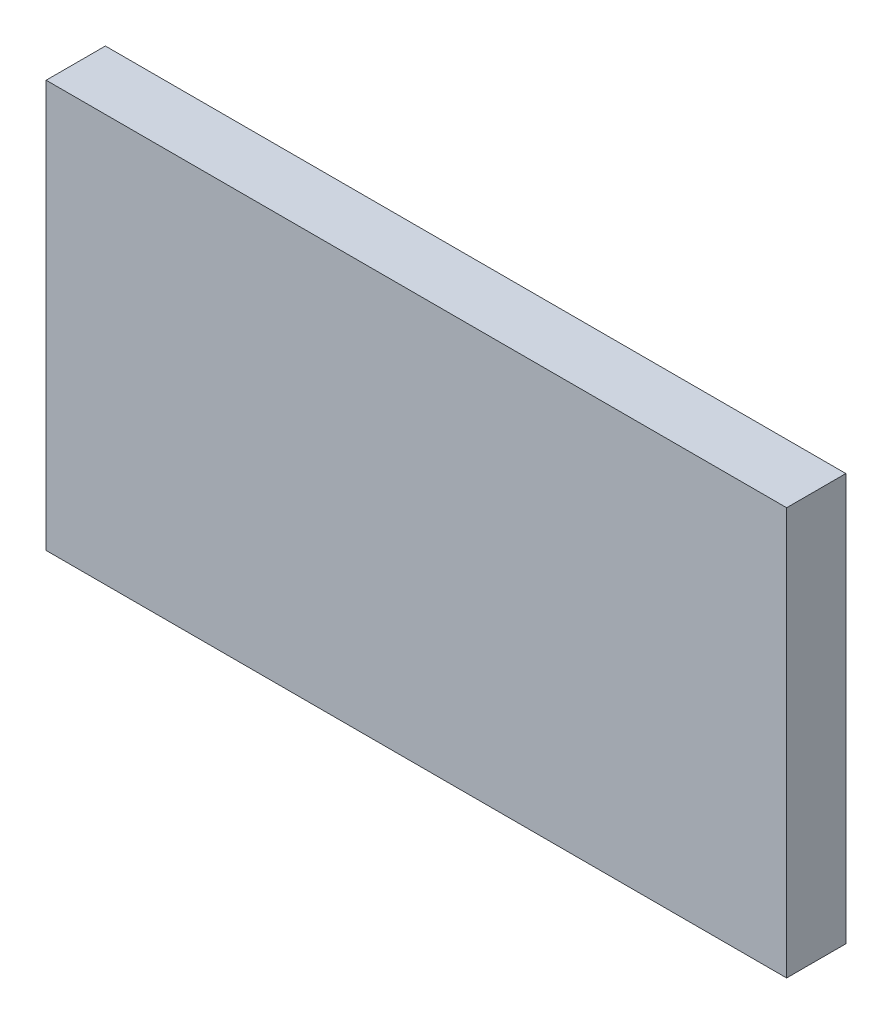
ISO-10303-21;
HEADER;
FILE_DESCRIPTION(('STEP AP214'),'2;1');
FILE_NAME('part.step','',(''),(''),'','','');
FILE_SCHEMA(('AUTOMOTIVE_DESIGN { 1 0 10303 214 1 1 1 1 }'));
ENDSEC;
DATA;
#1=APPLICATION_CONTEXT('core data for automotive mechanical design processes');
#2=APPLICATION_PROTOCOL_DEFINITION('international standard','automotive_design',2000,#1);
#3=PRODUCT_CONTEXT('',#1,'mechanical');
#4=PRODUCT('Part','Part','',(#3));
#5=PRODUCT_RELATED_PRODUCT_CATEGORY('part','',(#4));
#6=PRODUCT_DEFINITION_FORMATION('','',#4);
#7=PRODUCT_DEFINITION_CONTEXT('part definition',#1,'design');
#8=PRODUCT_DEFINITION('design','',#6,#7);
#9=PRODUCT_DEFINITION_SHAPE('','',#8);
#10=(LENGTH_UNIT() NAMED_UNIT(*) SI_UNIT(.MILLI.,.METRE.));
#11=(NAMED_UNIT(*) PLANE_ANGLE_UNIT() SI_UNIT($,.RADIAN.));
#12=(NAMED_UNIT(*) SI_UNIT($,.STERADIAN.) SOLID_ANGLE_UNIT());
#13=UNCERTAINTY_MEASURE_WITH_UNIT(LENGTH_MEASURE(1.E-05),#10,'distance_accuracy_value','');
#14=(GEOMETRIC_REPRESENTATION_CONTEXT(3) GLOBAL_UNCERTAINTY_ASSIGNED_CONTEXT((#13)) GLOBAL_UNIT_ASSIGNED_CONTEXT((#10,
#11,#12)) REPRESENTATION_CONTEXT('',''));
#15=CARTESIAN_POINT('',(0.,0.,0.));
#16=DIRECTION('',(0.,0.,1.));
#17=DIRECTION('',(1.,0.,0.));
#18=AXIS2_PLACEMENT_3D('',#15,#16,#17);
#19=CARTESIAN_POINT('',(50.,27.5,8.));
#20=DIRECTION('',(-1.,0.,0.));
#21=DIRECTION('',(0.,0.,1.));
#22=AXIS2_PLACEMENT_3D('',#19,#20,#21);
#23=PLANE('',#22);
#24=DIRECTION('',(0.,1.,0.));
#25=VECTOR('',#24,1.);
#26=CARTESIAN_POINT('',(50.,27.5,0.));
#27=LINE('',#26,#25);
#28=CARTESIAN_POINT('',(50.,-27.5,0.));
#29=VERTEX_POINT('',#28);
#30=CARTESIAN_POINT('',(50.,27.5,0.));
#31=VERTEX_POINT('',#30);
#32=EDGE_CURVE('E95',#29,#31,#27,.T.);
#33=ORIENTED_EDGE('',*,*,#32,.T.);
#34=DIRECTION('',(0.,0.,-1.));
#35=VECTOR('',#34,1.);
#36=CARTESIAN_POINT('',(50.,27.5,8.));
#37=LINE('',#36,#35);
#38=CARTESIAN_POINT('',(50.,27.5,8.));
#39=VERTEX_POINT('',#38);
#40=EDGE_CURVE('E11',#39,#31,#37,.T.);
#41=ORIENTED_EDGE('',*,*,#40,.F.);
#42=DIRECTION('',(0.,1.,0.));
#43=VECTOR('',#42,1.);
#44=CARTESIAN_POINT('',(50.,27.5,8.));
#45=LINE('',#44,#43);
#46=CARTESIAN_POINT('',(50.,-27.5,8.));
#47=VERTEX_POINT('',#46);
#48=EDGE_CURVE('E83',#47,#39,#45,.T.);
#49=ORIENTED_EDGE('',*,*,#48,.F.);
#50=DIRECTION('',(0.,0.,-1.));
#51=VECTOR('',#50,1.);
#52=CARTESIAN_POINT('',(50.,-27.5,8.));
#53=LINE('',#52,#51);
#54=EDGE_CURVE('E91',#47,#29,#53,.T.);
#55=ORIENTED_EDGE('',*,*,#54,.T.);
#56=EDGE_LOOP('',(#33,#41,#49,#55));
#57=FACE_BOUND('',#56,.T.);
#58=ADVANCED_FACE('F32',(#57),#23,.F.);
#59=CARTESIAN_POINT('',(-50.,27.5,8.));
#60=DIRECTION('',(0.,-1.,0.));
#61=DIRECTION('',(0.,0.,-1.));
#62=AXIS2_PLACEMENT_3D('',#59,#60,#61);
#63=PLANE('',#62);
#64=DIRECTION('',(-1.,0.,0.));
#65=VECTOR('',#64,1.);
#66=CARTESIAN_POINT('',(-50.,27.5,0.));
#67=LINE('',#66,#65);
#68=CARTESIAN_POINT('',(-50.,27.5,0.));
#69=VERTEX_POINT('',#68);
#70=EDGE_CURVE('E87',#31,#69,#67,.T.);
#71=ORIENTED_EDGE('',*,*,#70,.T.);
#72=DIRECTION('',(0.,0.,-1.));
#73=VECTOR('',#72,1.);
#74=CARTESIAN_POINT('',(-50.,27.5,8.));
#75=LINE('',#74,#73);
#76=CARTESIAN_POINT('',(-50.,27.5,8.));
#77=VERTEX_POINT('',#76);
#78=EDGE_CURVE('E40',#77,#69,#75,.T.);
#79=ORIENTED_EDGE('',*,*,#78,.F.);
#80=DIRECTION('',(-1.,0.,0.));
#81=VECTOR('',#80,1.);
#82=CARTESIAN_POINT('',(-50.,27.5,8.));
#83=LINE('',#82,#81);
#84=EDGE_CURVE('E78',#39,#77,#83,.T.);
#85=ORIENTED_EDGE('',*,*,#84,.F.);
#86=ORIENTED_EDGE('',*,*,#40,.T.);
#87=EDGE_LOOP('',(#71,#79,#85,#86));
#88=FACE_BOUND('',#87,.T.);
#89=ADVANCED_FACE('F86',(#88),#63,.F.);
#90=CARTESIAN_POINT('',(-50.,27.5,8.));
#91=DIRECTION('',(1.,0.,0.));
#92=DIRECTION('',(0.,0.,-1.));
#93=AXIS2_PLACEMENT_3D('',#90,#91,#92);
#94=PLANE('',#93);
#95=DIRECTION('',(0.,-1.,0.));
#96=VECTOR('',#95,1.);
#97=CARTESIAN_POINT('',(-50.,27.5,0.));
#98=LINE('',#97,#96);
#99=CARTESIAN_POINT('',(-50.,-27.5,0.));
#100=VERTEX_POINT('',#99);
#101=EDGE_CURVE('E65',#69,#100,#98,.T.);
#102=ORIENTED_EDGE('',*,*,#101,.T.);
#103=DIRECTION('',(0.,0.,-1.));
#104=VECTOR('',#103,1.);
#105=CARTESIAN_POINT('',(-50.,-27.5,8.));
#106=LINE('',#105,#104);
#107=CARTESIAN_POINT('',(-50.,-27.5,8.));
#108=VERTEX_POINT('',#107);
#109=EDGE_CURVE('E88',#108,#100,#106,.T.);
#110=ORIENTED_EDGE('',*,*,#109,.F.);
#111=DIRECTION('',(0.,-1.,0.));
#112=VECTOR('',#111,1.);
#113=CARTESIAN_POINT('',(-50.,27.5,8.));
#114=LINE('',#113,#112);
#115=EDGE_CURVE('E81',#77,#108,#114,.T.);
#116=ORIENTED_EDGE('',*,*,#115,.F.);
#117=ORIENTED_EDGE('',*,*,#78,.T.);
#118=EDGE_LOOP('',(#102,#110,#116,#117));
#119=FACE_BOUND('',#118,.T.);
#120=ADVANCED_FACE('F89',(#119),#94,.F.);
#121=CARTESIAN_POINT('',(-50.,-27.5,8.));
#122=DIRECTION('',(0.,1.,0.));
#123=DIRECTION('',(0.,0.,1.));
#124=AXIS2_PLACEMENT_3D('',#121,#122,#123);
#125=PLANE('',#124);
#126=DIRECTION('',(1.,0.,0.));
#127=VECTOR('',#126,1.);
#128=CARTESIAN_POINT('',(-50.,-27.5,0.));
#129=LINE('',#128,#127);
#130=EDGE_CURVE('E71',#100,#29,#129,.T.);
#131=ORIENTED_EDGE('',*,*,#130,.T.);
#132=ORIENTED_EDGE('',*,*,#54,.F.);
#133=DIRECTION('',(1.,0.,0.));
#134=VECTOR('',#133,1.);
#135=CARTESIAN_POINT('',(-50.,-27.5,8.));
#136=LINE('',#135,#134);
#137=EDGE_CURVE('E48',#108,#47,#136,.T.);
#138=ORIENTED_EDGE('',*,*,#137,.F.);
#139=ORIENTED_EDGE('',*,*,#109,.T.);
#140=EDGE_LOOP('',(#131,#132,#138,#139));
#141=FACE_BOUND('',#140,.T.);
#142=ADVANCED_FACE('F102',(#141),#125,.F.);
#143=CARTESIAN_POINT('',(0.,0.,8.));
#144=DIRECTION('',(0.,0.,1.));
#145=DIRECTION('',(1.,0.,0.));
#146=AXIS2_PLACEMENT_3D('',#143,#144,#145);
#147=PLANE('',#146);
#148=ORIENTED_EDGE('',*,*,#48,.T.);
#149=ORIENTED_EDGE('',*,*,#84,.T.);
#150=ORIENTED_EDGE('',*,*,#115,.T.);
#151=ORIENTED_EDGE('',*,*,#137,.T.);
#152=EDGE_LOOP('',(#148,#149,#150,#151));
#153=FACE_BOUND('',#152,.T.);
#154=ADVANCED_FACE('F79',(#153),#147,.T.);
#155=CARTESIAN_POINT('',(0.,0.,0.));
#156=DIRECTION('',(0.,0.,1.));
#157=DIRECTION('',(1.,0.,0.));
#158=AXIS2_PLACEMENT_3D('',#155,#156,#157);
#159=PLANE('',#158);
#160=ORIENTED_EDGE('',*,*,#32,.F.);
#161=ORIENTED_EDGE('',*,*,#130,.F.);
#162=ORIENTED_EDGE('',*,*,#101,.F.);
#163=ORIENTED_EDGE('',*,*,#70,.F.);
#164=EDGE_LOOP('',(#160,#161,#162,#163));
#165=FACE_BOUND('',#164,.T.);
#166=ADVANCED_FACE('F105',(#165),#159,.F.);
#167=CLOSED_SHELL('',(#58,#89,#120,#142,#154,#166));
#168=MANIFOLD_SOLID_BREP('B2',#167);
#169=ADVANCED_BREP_SHAPE_REPRESENTATION('',(#18,#168),#14);
#170=SHAPE_DEFINITION_REPRESENTATION(#9,#169);
ENDSEC;
END-ISO-10303-21;
